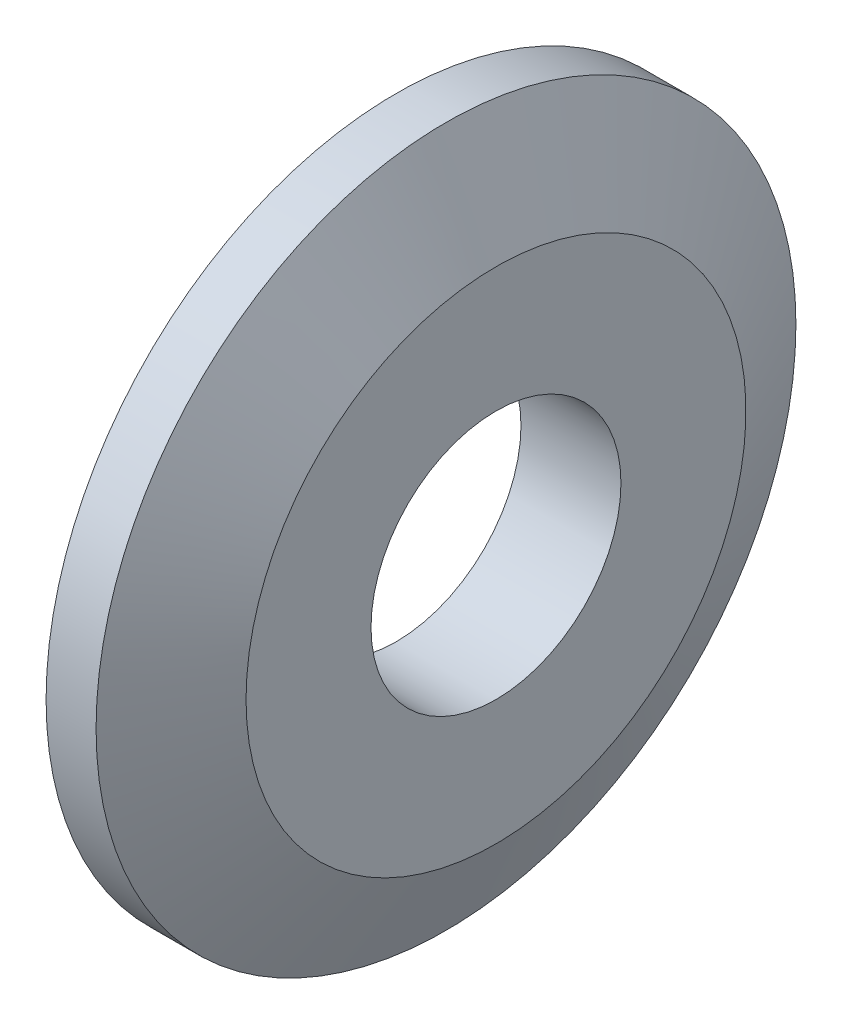
ISO-10303-21;
HEADER;
FILE_DESCRIPTION(('STEP AP214'),'2;1');
FILE_NAME('part.step','',(''),(''),'','','');
FILE_SCHEMA(('AUTOMOTIVE_DESIGN { 1 0 10303 214 1 1 1 1 }'));
ENDSEC;
DATA;
#1=APPLICATION_CONTEXT('core data for automotive mechanical design processes');
#2=APPLICATION_PROTOCOL_DEFINITION('international standard','automotive_design',2000,#1);
#3=PRODUCT_CONTEXT('',#1,'mechanical');
#4=PRODUCT('Part','Part','',(#3));
#5=PRODUCT_RELATED_PRODUCT_CATEGORY('part','',(#4));
#6=PRODUCT_DEFINITION_FORMATION('','',#4);
#7=PRODUCT_DEFINITION_CONTEXT('part definition',#1,'design');
#8=PRODUCT_DEFINITION('design','',#6,#7);
#9=PRODUCT_DEFINITION_SHAPE('','',#8);
#10=(LENGTH_UNIT() NAMED_UNIT(*) SI_UNIT(.MILLI.,.METRE.));
#11=(NAMED_UNIT(*) PLANE_ANGLE_UNIT() SI_UNIT($,.RADIAN.));
#12=(NAMED_UNIT(*) SI_UNIT($,.STERADIAN.) SOLID_ANGLE_UNIT());
#13=UNCERTAINTY_MEASURE_WITH_UNIT(LENGTH_MEASURE(1.E-05),#10,'distance_accuracy_value','');
#14=(GEOMETRIC_REPRESENTATION_CONTEXT(3) GLOBAL_UNCERTAINTY_ASSIGNED_CONTEXT((#13)) GLOBAL_UNIT_ASSIGNED_CONTEXT((#10,
#11,#12)) REPRESENTATION_CONTEXT('',''));
#15=CARTESIAN_POINT('',(0.,0.,0.));
#16=DIRECTION('',(0.,0.,1.));
#17=DIRECTION('',(1.,0.,0.));
#18=AXIS2_PLACEMENT_3D('',#15,#16,#17);
#19=CARTESIAN_POINT('',(0.,0.,0.));
#20=DIRECTION('',(-1.,0.,0.));
#21=DIRECTION('',(0.,0.,1.));
#22=AXIS2_PLACEMENT_3D('',#19,#20,#21);
#23=CYLINDRICAL_SURFACE('',#22,2.5);
#24=CARTESIAN_POINT('',(2.,0.,0.));
#25=DIRECTION('',(-1.,0.,0.));
#26=DIRECTION('',(0.,0.,1.));
#27=AXIS2_PLACEMENT_3D('',#24,#25,#26);
#28=CIRCLE('',#27,2.5);
#29=CARTESIAN_POINT('',(2.,0.,2.5));
#30=VERTEX_POINT('',#29);
#31=EDGE_CURVE('E49',#30,#30,#28,.T.);
#32=ORIENTED_EDGE('',*,*,#31,.F.);
#33=EDGE_LOOP('',(#32));
#34=FACE_BOUND('',#33,.T.);
#35=CARTESIAN_POINT('',(0.,0.,0.));
#36=DIRECTION('',(-1.,0.,0.));
#37=DIRECTION('',(0.,0.,1.));
#38=AXIS2_PLACEMENT_3D('',#35,#36,#37);
#39=CIRCLE('',#38,2.5);
#40=CARTESIAN_POINT('',(0.,0.,2.5));
#41=VERTEX_POINT('',#40);
#42=EDGE_CURVE('E10',#41,#41,#39,.T.);
#43=ORIENTED_EDGE('',*,*,#42,.T.);
#44=EDGE_LOOP('',(#43));
#45=FACE_BOUND('',#44,.T.);
#46=ADVANCED_FACE('F30',(#34,#45),#23,.F.);
#47=CARTESIAN_POINT('',(0.,2.5,0.));
#48=DIRECTION('',(1.,0.,0.));
#49=DIRECTION('',(0.,0.,-1.));
#50=AXIS2_PLACEMENT_3D('',#47,#48,#49);
#51=PLANE('',#50);
#52=ORIENTED_EDGE('',*,*,#42,.F.);
#53=EDGE_LOOP('',(#52));
#54=FACE_BOUND('',#53,.T.);
#55=CARTESIAN_POINT('',(0.,0.,0.));
#56=DIRECTION('',(-1.,0.,0.));
#57=DIRECTION('',(0.,0.,1.));
#58=AXIS2_PLACEMENT_3D('',#55,#56,#57);
#59=CIRCLE('',#58,7.);
#60=CARTESIAN_POINT('',(0.,0.,7.));
#61=VERTEX_POINT('',#60);
#62=EDGE_CURVE('E36',#61,#61,#59,.T.);
#63=ORIENTED_EDGE('',*,*,#62,.T.);
#64=EDGE_LOOP('',(#63));
#65=FACE_BOUND('',#64,.T.);
#66=ADVANCED_FACE('F56',(#54,#65),#51,.F.);
#67=CARTESIAN_POINT('',(0.,0.,0.));
#68=DIRECTION('',(-1.,0.,0.));
#69=DIRECTION('',(0.,0.,1.));
#70=AXIS2_PLACEMENT_3D('',#67,#68,#69);
#71=CYLINDRICAL_SURFACE('',#70,7.);
#72=ORIENTED_EDGE('',*,*,#62,.F.);
#73=EDGE_LOOP('',(#72));
#74=FACE_BOUND('',#73,.T.);
#75=CARTESIAN_POINT('',(1.,0.,0.));
#76=DIRECTION('',(-1.,0.,0.));
#77=DIRECTION('',(0.,0.,1.));
#78=AXIS2_PLACEMENT_3D('',#75,#76,#77);
#79=CIRCLE('',#78,7.);
#80=CARTESIAN_POINT('',(1.,0.,7.));
#81=VERTEX_POINT('',#80);
#82=EDGE_CURVE('E40',#81,#81,#79,.T.);
#83=ORIENTED_EDGE('',*,*,#82,.T.);
#84=EDGE_LOOP('',(#83));
#85=FACE_BOUND('',#84,.T.);
#86=ADVANCED_FACE('F60',(#74,#85),#71,.T.);
#87=CARTESIAN_POINT('',(2.,0.,0.));
#88=DIRECTION('',(-1.,0.,0.));
#89=DIRECTION('',(0.,0.,1.));
#90=AXIS2_PLACEMENT_3D('',#87,#88,#89);
#91=CONICAL_SURFACE('',#90,5.,1.10714871779409);
#92=ORIENTED_EDGE('',*,*,#82,.F.);
#93=EDGE_LOOP('',(#92));
#94=FACE_BOUND('',#93,.T.);
#95=CARTESIAN_POINT('',(2.,0.,0.));
#96=DIRECTION('',(-1.,0.,0.));
#97=DIRECTION('',(0.,0.,1.));
#98=AXIS2_PLACEMENT_3D('',#95,#96,#97);
#99=CIRCLE('',#98,5.);
#100=CARTESIAN_POINT('',(2.,0.,5.));
#101=VERTEX_POINT('',#100);
#102=EDGE_CURVE('E44',#101,#101,#99,.T.);
#103=ORIENTED_EDGE('',*,*,#102,.T.);
#104=EDGE_LOOP('',(#103));
#105=FACE_BOUND('',#104,.T.);
#106=ADVANCED_FACE('F65',(#94,#105),#91,.T.);
#107=CARTESIAN_POINT('',(2.,5.,0.));
#108=DIRECTION('',(-1.,0.,0.));
#109=DIRECTION('',(0.,0.,1.));
#110=AXIS2_PLACEMENT_3D('',#107,#108,#109);
#111=PLANE('',#110);
#112=ORIENTED_EDGE('',*,*,#102,.F.);
#113=EDGE_LOOP('',(#112));
#114=FACE_BOUND('',#113,.T.);
#115=ORIENTED_EDGE('',*,*,#31,.T.);
#116=EDGE_LOOP('',(#115));
#117=FACE_BOUND('',#116,.T.);
#118=ADVANCED_FACE('F53',(#114,#117),#111,.F.);
#119=CLOSED_SHELL('',(#46,#66,#86,#106,#118));
#120=MANIFOLD_SOLID_BREP('B2',#119);
#121=ADVANCED_BREP_SHAPE_REPRESENTATION('',(#18,#120),#14);
#122=SHAPE_DEFINITION_REPRESENTATION(#9,#121);
ENDSEC;
END-ISO-10303-21;
